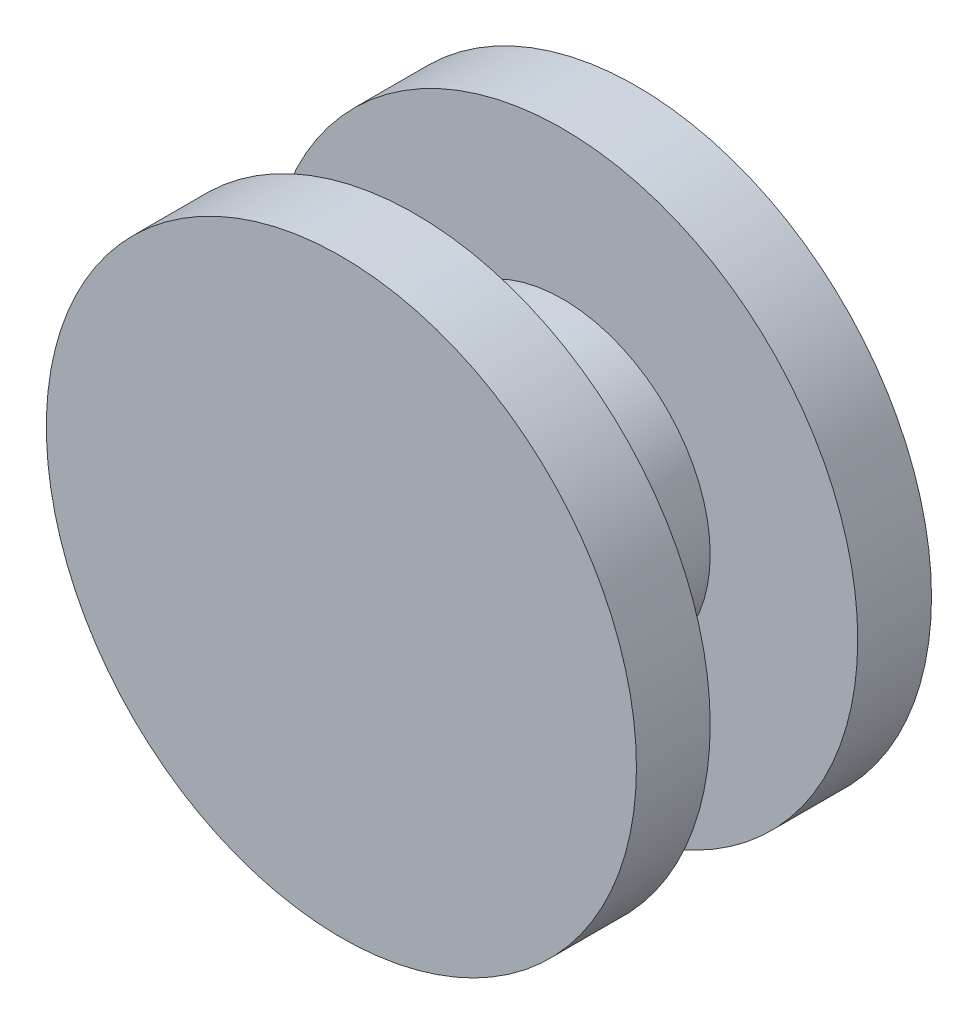
ISO-10303-21;
HEADER;
FILE_DESCRIPTION(('STEP AP214'),'2;1');
FILE_NAME('part.step','',(''),(''),'','','');
FILE_SCHEMA(('AUTOMOTIVE_DESIGN { 1 0 10303 214 1 1 1 1 }'));
ENDSEC;
DATA;
#1=APPLICATION_CONTEXT('core data for automotive mechanical design processes');
#2=APPLICATION_PROTOCOL_DEFINITION('international standard','automotive_design',2000,#1);
#3=PRODUCT_CONTEXT('',#1,'mechanical');
#4=PRODUCT('Part','Part','',(#3));
#5=PRODUCT_RELATED_PRODUCT_CATEGORY('part','',(#4));
#6=PRODUCT_DEFINITION_FORMATION('','',#4);
#7=PRODUCT_DEFINITION_CONTEXT('part definition',#1,'design');
#8=PRODUCT_DEFINITION('design','',#6,#7);
#9=PRODUCT_DEFINITION_SHAPE('','',#8);
#10=(LENGTH_UNIT() NAMED_UNIT(*) SI_UNIT(.MILLI.,.METRE.));
#11=(NAMED_UNIT(*) PLANE_ANGLE_UNIT() SI_UNIT($,.RADIAN.));
#12=(NAMED_UNIT(*) SI_UNIT($,.STERADIAN.) SOLID_ANGLE_UNIT());
#13=UNCERTAINTY_MEASURE_WITH_UNIT(LENGTH_MEASURE(1.E-05),#10,'distance_accuracy_value','');
#14=(GEOMETRIC_REPRESENTATION_CONTEXT(3) GLOBAL_UNCERTAINTY_ASSIGNED_CONTEXT((#13)) GLOBAL_UNIT_ASSIGNED_CONTEXT((#10,
#11,#12)) REPRESENTATION_CONTEXT('',''));
#15=CARTESIAN_POINT('',(0.,0.,0.));
#16=DIRECTION('',(0.,0.,1.));
#17=DIRECTION('',(1.,0.,0.));
#18=AXIS2_PLACEMENT_3D('',#15,#16,#17);
#19=CARTESIAN_POINT('',(0.,0.,10.));
#20=DIRECTION('',(0.,0.,-1.));
#21=DIRECTION('',(-1.,0.,0.));
#22=AXIS2_PLACEMENT_3D('',#19,#20,#21);
#23=CYLINDRICAL_SURFACE('',#22,10.);
#24=CARTESIAN_POINT('',(0.,0.,0.));
#25=DIRECTION('',(0.,0.,1.));
#26=DIRECTION('',(1.,0.,0.));
#27=AXIS2_PLACEMENT_3D('',#24,#25,#26);
#28=CIRCLE('',#27,10.);
#29=CARTESIAN_POINT('',(10.,0.,0.));
#30=VERTEX_POINT('',#29);
#31=EDGE_CURVE('E34',#30,#30,#28,.T.);
#32=ORIENTED_EDGE('',*,*,#31,.T.);
#33=EDGE_LOOP('',(#32));
#34=FACE_BOUND('',#33,.T.);
#35=CARTESIAN_POINT('',(0.,0.,2.5));
#36=DIRECTION('',(0.,0.,1.));
#37=DIRECTION('',(1.,0.,0.));
#38=AXIS2_PLACEMENT_3D('',#35,#36,#37);
#39=CIRCLE('',#38,10.);
#40=CARTESIAN_POINT('',(10.,0.,2.5));
#41=VERTEX_POINT('',#40);
#42=EDGE_CURVE('E41',#41,#41,#39,.T.);
#43=ORIENTED_EDGE('',*,*,#42,.F.);
#44=EDGE_LOOP('',(#43));
#45=FACE_BOUND('',#44,.T.);
#46=ADVANCED_FACE('F31',(#34,#45),#23,.T.);
#47=CARTESIAN_POINT('',(0.,0.,0.));
#48=DIRECTION('',(0.,0.,1.));
#49=DIRECTION('',(1.,0.,0.));
#50=AXIS2_PLACEMENT_3D('',#47,#48,#49);
#51=PLANE('',#50);
#52=ORIENTED_EDGE('',*,*,#31,.F.);
#53=EDGE_LOOP('',(#52));
#54=FACE_BOUND('',#53,.T.);
#55=ADVANCED_FACE('F61',(#54),#51,.F.);
#56=CARTESIAN_POINT('',(0.,10.,2.5));
#57=DIRECTION('',(0.,0.,1.));
#58=DIRECTION('',(1.,0.,0.));
#59=AXIS2_PLACEMENT_3D('',#56,#57,#58);
#60=PLANE('',#59);
#61=ORIENTED_EDGE('',*,*,#42,.T.);
#62=EDGE_LOOP('',(#61));
#63=FACE_BOUND('',#62,.T.);
#64=CARTESIAN_POINT('',(0.,0.,2.5));
#65=DIRECTION('',(0.,0.,1.));
#66=DIRECTION('',(1.,0.,0.));
#67=AXIS2_PLACEMENT_3D('',#64,#65,#66);
#68=CIRCLE('',#67,5.);
#69=CARTESIAN_POINT('',(5.,0.,2.5));
#70=VERTEX_POINT('',#69);
#71=EDGE_CURVE('E51',#70,#70,#68,.T.);
#72=ORIENTED_EDGE('',*,*,#71,.F.);
#73=EDGE_LOOP('',(#72));
#74=FACE_BOUND('',#73,.T.);
#75=ADVANCED_FACE('F58',(#63,#74),#60,.T.);
#76=CARTESIAN_POINT('',(0.,10.,7.49999999999999));
#77=DIRECTION('',(0.,0.,-1.));
#78=DIRECTION('',(-1.,0.,0.));
#79=AXIS2_PLACEMENT_3D('',#76,#77,#78);
#80=PLANE('',#79);
#81=CARTESIAN_POINT('',(0.,0.,7.49999999999999));
#82=DIRECTION('',(0.,0.,1.));
#83=DIRECTION('',(1.,0.,0.));
#84=AXIS2_PLACEMENT_3D('',#81,#82,#83);
#85=CIRCLE('',#84,5.);
#86=CARTESIAN_POINT('',(5.,0.,7.49999999999999));
#87=VERTEX_POINT('',#86);
#88=EDGE_CURVE('E48',#87,#87,#85,.T.);
#89=ORIENTED_EDGE('',*,*,#88,.T.);
#90=EDGE_LOOP('',(#89));
#91=FACE_BOUND('',#90,.T.);
#92=CARTESIAN_POINT('',(0.,0.,7.5));
#93=DIRECTION('',(0.,0.,1.));
#94=DIRECTION('',(1.,0.,0.));
#95=AXIS2_PLACEMENT_3D('',#92,#93,#94);
#96=CIRCLE('',#95,10.);
#97=CARTESIAN_POINT('',(10.,0.,7.5));
#98=VERTEX_POINT('',#97);
#99=EDGE_CURVE('E45',#98,#98,#96,.T.);
#100=ORIENTED_EDGE('',*,*,#99,.F.);
#101=EDGE_LOOP('',(#100));
#102=FACE_BOUND('',#101,.T.);
#103=ADVANCED_FACE('F60',(#91,#102),#80,.T.);
#104=CARTESIAN_POINT('',(0.,0.,10.));
#105=DIRECTION('',(0.,0.,1.));
#106=DIRECTION('',(1.,0.,0.));
#107=AXIS2_PLACEMENT_3D('',#104,#105,#106);
#108=CYLINDRICAL_SURFACE('',#107,5.);
#109=ORIENTED_EDGE('',*,*,#71,.T.);
#110=EDGE_LOOP('',(#109));
#111=FACE_BOUND('',#110,.T.);
#112=ORIENTED_EDGE('',*,*,#88,.F.);
#113=EDGE_LOOP('',(#112));
#114=FACE_BOUND('',#113,.T.);
#115=ADVANCED_FACE('F55',(#111,#114),#108,.T.);
#116=CARTESIAN_POINT('',(0.,0.,10.));
#117=DIRECTION('',(0.,0.,1.));
#118=DIRECTION('',(1.,0.,0.));
#119=AXIS2_PLACEMENT_3D('',#116,#117,#118);
#120=PLANE('',#119);
#121=CARTESIAN_POINT('',(0.,0.,10.));
#122=DIRECTION('',(0.,0.,1.));
#123=DIRECTION('',(1.,0.,0.));
#124=AXIS2_PLACEMENT_3D('',#121,#122,#123);
#125=CIRCLE('',#124,10.);
#126=CARTESIAN_POINT('',(10.,0.,10.));
#127=VERTEX_POINT('',#126);
#128=EDGE_CURVE('E10',#127,#127,#125,.T.);
#129=ORIENTED_EDGE('',*,*,#128,.T.);
#130=EDGE_LOOP('',(#129));
#131=FACE_BOUND('',#130,.T.);
#132=ADVANCED_FACE('F79',(#131),#120,.T.);
#133=ORIENTED_EDGE('',*,*,#128,.F.);
#134=EDGE_LOOP('',(#133));
#135=FACE_BOUND('',#134,.T.);
#136=ORIENTED_EDGE('',*,*,#99,.T.);
#137=EDGE_LOOP('',(#136));
#138=FACE_BOUND('',#137,.T.);
#139=ADVANCED_FACE('F74',(#135,#138),#23,.T.);
#140=CLOSED_SHELL('',(#46,#55,#75,#103,#115,#132,#139));
#141=MANIFOLD_SOLID_BREP('B2',#140);
#142=ADVANCED_BREP_SHAPE_REPRESENTATION('',(#18,#141),#14);
#143=SHAPE_DEFINITION_REPRESENTATION(#9,#142);
ENDSEC;
END-ISO-10303-21;
